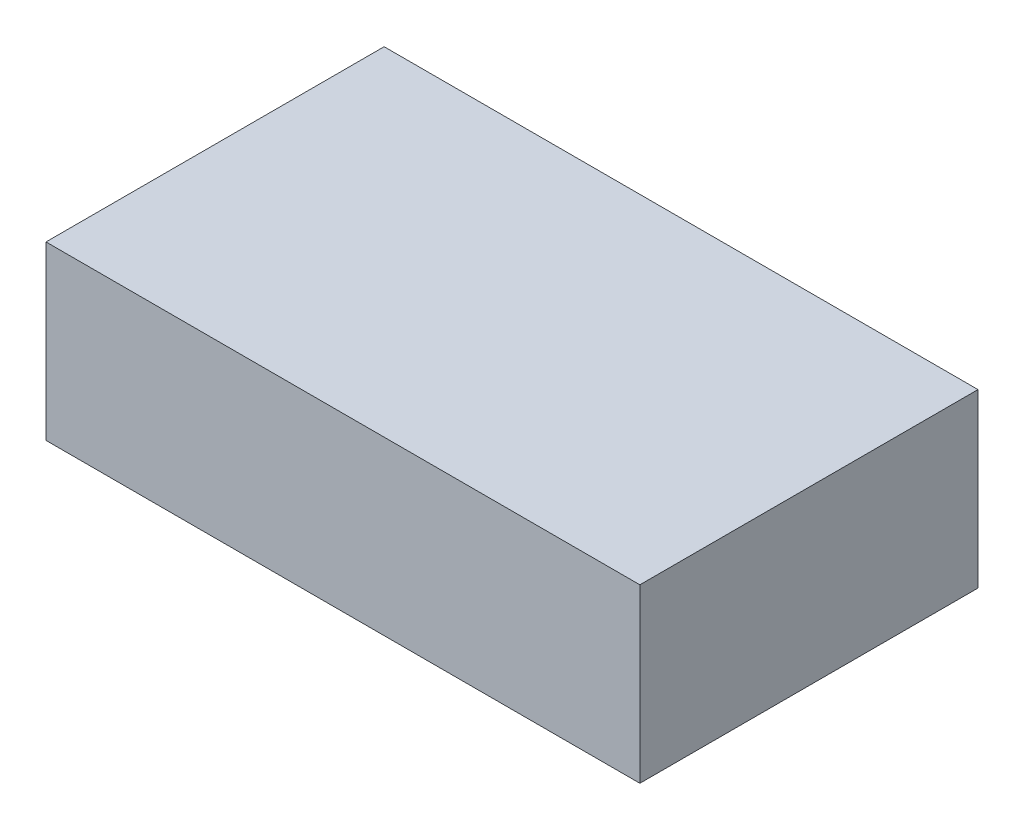
ISO-10303-21;
HEADER;
FILE_DESCRIPTION(('STEP AP214'),'2;1');
FILE_NAME('part.step','',(''),(''),'','','');
FILE_SCHEMA(('AUTOMOTIVE_DESIGN { 1 0 10303 214 1 1 1 1 }'));
ENDSEC;
DATA;
#1=APPLICATION_CONTEXT('core data for automotive mechanical design processes');
#2=APPLICATION_PROTOCOL_DEFINITION('international standard','automotive_design',2000,#1);
#3=PRODUCT_CONTEXT('',#1,'mechanical');
#4=PRODUCT('Part','Part','',(#3));
#5=PRODUCT_RELATED_PRODUCT_CATEGORY('part','',(#4));
#6=PRODUCT_DEFINITION_FORMATION('','',#4);
#7=PRODUCT_DEFINITION_CONTEXT('part definition',#1,'design');
#8=PRODUCT_DEFINITION('design','',#6,#7);
#9=PRODUCT_DEFINITION_SHAPE('','',#8);
#10=(LENGTH_UNIT() NAMED_UNIT(*) SI_UNIT(.MILLI.,.METRE.));
#11=(NAMED_UNIT(*) PLANE_ANGLE_UNIT() SI_UNIT($,.RADIAN.));
#12=(NAMED_UNIT(*) SI_UNIT($,.STERADIAN.) SOLID_ANGLE_UNIT());
#13=UNCERTAINTY_MEASURE_WITH_UNIT(LENGTH_MEASURE(1.E-05),#10,'distance_accuracy_value','');
#14=(GEOMETRIC_REPRESENTATION_CONTEXT(3) GLOBAL_UNCERTAINTY_ASSIGNED_CONTEXT((#13)) GLOBAL_UNIT_ASSIGNED_CONTEXT((#10,
#11,#12)) REPRESENTATION_CONTEXT('',''));
#15=CARTESIAN_POINT('',(0.,0.,0.));
#16=DIRECTION('',(0.,0.,1.));
#17=DIRECTION('',(1.,0.,0.));
#18=AXIS2_PLACEMENT_3D('',#15,#16,#17);
#19=CARTESIAN_POINT('',(52.25,30.25,-29.75));
#20=DIRECTION('',(-1.,0.,0.));
#21=DIRECTION('',(0.,0.,1.));
#22=AXIS2_PLACEMENT_3D('',#19,#20,#21);
#23=PLANE('',#22);
#24=DIRECTION('',(0.,0.,-1.));
#25=VECTOR('',#24,1.);
#26=CARTESIAN_POINT('',(52.25,0.,-29.75));
#27=LINE('',#26,#25);
#28=CARTESIAN_POINT('',(52.25,0.,29.75));
#29=VERTEX_POINT('',#28);
#30=CARTESIAN_POINT('',(52.25,0.,-29.75));
#31=VERTEX_POINT('',#30);
#32=EDGE_CURVE('E147',#29,#31,#27,.T.);
#33=ORIENTED_EDGE('',*,*,#32,.T.);
#34=DIRECTION('',(0.,-1.,0.));
#35=VECTOR('',#34,1.);
#36=CARTESIAN_POINT('',(52.25,30.25,-29.75));
#37=LINE('',#36,#35);
#38=CARTESIAN_POINT('',(52.25,30.25,-29.75));
#39=VERTEX_POINT('',#38);
#40=EDGE_CURVE('E47',#39,#31,#37,.T.);
#41=ORIENTED_EDGE('',*,*,#40,.F.);
#42=DIRECTION('',(0.,0.,-1.));
#43=VECTOR('',#42,1.);
#44=CARTESIAN_POINT('',(52.25,30.25,-29.75));
#45=LINE('',#44,#43);
#46=CARTESIAN_POINT('',(52.25,30.25,29.75));
#47=VERTEX_POINT('',#46);
#48=EDGE_CURVE('E148',#47,#39,#45,.T.);
#49=ORIENTED_EDGE('',*,*,#48,.F.);
#50=DIRECTION('',(0.,-1.,0.));
#51=VECTOR('',#50,1.);
#52=CARTESIAN_POINT('',(52.25,30.25,29.75));
#53=LINE('',#52,#51);
#54=EDGE_CURVE('E154',#47,#29,#53,.T.);
#55=ORIENTED_EDGE('',*,*,#54,.T.);
#56=EDGE_LOOP('',(#33,#41,#49,#55));
#57=FACE_BOUND('',#56,.T.);
#58=ADVANCED_FACE('F39',(#57),#23,.F.);
#59=CARTESIAN_POINT('',(-52.25,30.25,-29.75));
#60=DIRECTION('',(0.,0.,1.));
#61=DIRECTION('',(1.,0.,0.));
#62=AXIS2_PLACEMENT_3D('',#59,#60,#61);
#63=PLANE('',#62);
#64=DIRECTION('',(-1.,0.,0.));
#65=VECTOR('',#64,1.);
#66=CARTESIAN_POINT('',(-52.25,0.,-29.75));
#67=LINE('',#66,#65);
#68=CARTESIAN_POINT('',(-52.25,0.,-29.75));
#69=VERTEX_POINT('',#68);
#70=EDGE_CURVE('E157',#31,#69,#67,.T.);
#71=ORIENTED_EDGE('',*,*,#70,.T.);
#72=DIRECTION('',(0.,-1.,0.));
#73=VECTOR('',#72,1.);
#74=CARTESIAN_POINT('',(-52.25,30.25,-29.75));
#75=LINE('',#74,#73);
#76=CARTESIAN_POINT('',(-52.25,30.25,-29.75));
#77=VERTEX_POINT('',#76);
#78=EDGE_CURVE('E164',#77,#69,#75,.T.);
#79=ORIENTED_EDGE('',*,*,#78,.F.);
#80=DIRECTION('',(-1.,0.,0.));
#81=VECTOR('',#80,1.);
#82=CARTESIAN_POINT('',(-52.25,30.25,-29.75));
#83=LINE('',#82,#81);
#84=EDGE_CURVE('E87',#39,#77,#83,.T.);
#85=ORIENTED_EDGE('',*,*,#84,.F.);
#86=ORIENTED_EDGE('',*,*,#40,.T.);
#87=EDGE_LOOP('',(#71,#79,#85,#86));
#88=FACE_BOUND('',#87,.T.);
#89=ADVANCED_FACE('F166',(#88),#63,.F.);
#90=CARTESIAN_POINT('',(-52.25,30.25,-29.75));
#91=DIRECTION('',(1.,0.,0.));
#92=DIRECTION('',(0.,0.,-1.));
#93=AXIS2_PLACEMENT_3D('',#90,#91,#92);
#94=PLANE('',#93);
#95=CARTESIAN_POINT('',(-52.25,11.6,0.));
#96=DIRECTION('',(1.,0.,0.));
#97=DIRECTION('',(0.,0.,-1.));
#98=AXIS2_PLACEMENT_3D('',#95,#96,#97);
#99=CIRCLE('',#98,2.);
#100=CARTESIAN_POINT('',(-52.25,11.6,-2.));
#101=VERTEX_POINT('',#100);
#102=EDGE_CURVE('E11',#101,#101,#99,.F.);
#103=ORIENTED_EDGE('',*,*,#102,.F.);
#104=EDGE_LOOP('',(#103));
#105=FACE_BOUND('',#104,.T.);
#106=DIRECTION('',(0.,0.,1.));
#107=VECTOR('',#106,1.);
#108=CARTESIAN_POINT('',(-52.25,0.,-29.75));
#109=LINE('',#108,#107);
#110=CARTESIAN_POINT('',(-52.25,0.,29.75));
#111=VERTEX_POINT('',#110);
#112=EDGE_CURVE('E73',#69,#111,#109,.T.);
#113=ORIENTED_EDGE('',*,*,#112,.T.);
#114=DIRECTION('',(0.,-1.,0.));
#115=VECTOR('',#114,1.);
#116=CARTESIAN_POINT('',(-52.25,30.25,29.75));
#117=LINE('',#116,#115);
#118=CARTESIAN_POINT('',(-52.25,30.25,29.75));
#119=VERTEX_POINT('',#118);
#120=EDGE_CURVE('E162',#119,#111,#117,.T.);
#121=ORIENTED_EDGE('',*,*,#120,.F.);
#122=DIRECTION('',(0.,0.,1.));
#123=VECTOR('',#122,1.);
#124=CARTESIAN_POINT('',(-52.25,30.25,-29.75));
#125=LINE('',#124,#123);
#126=EDGE_CURVE('E151',#77,#119,#125,.T.);
#127=ORIENTED_EDGE('',*,*,#126,.F.);
#128=ORIENTED_EDGE('',*,*,#78,.T.);
#129=EDGE_LOOP('',(#113,#121,#127,#128));
#130=FACE_BOUND('',#129,.T.);
#131=ADVANCED_FACE('F195',(#105,#130),#94,.F.);
#132=CARTESIAN_POINT('',(-52.25,30.25,29.75));
#133=DIRECTION('',(0.,0.,-1.));
#134=DIRECTION('',(-1.,0.,0.));
#135=AXIS2_PLACEMENT_3D('',#132,#133,#134);
#136=PLANE('',#135);
#137=DIRECTION('',(1.,0.,0.));
#138=VECTOR('',#137,1.);
#139=CARTESIAN_POINT('',(-52.25,0.,29.75));
#140=LINE('',#139,#138);
#141=EDGE_CURVE('E79',#111,#29,#140,.T.);
#142=ORIENTED_EDGE('',*,*,#141,.T.);
#143=ORIENTED_EDGE('',*,*,#54,.F.);
#144=DIRECTION('',(1.,0.,0.));
#145=VECTOR('',#144,1.);
#146=CARTESIAN_POINT('',(-52.25,30.25,29.75));
#147=LINE('',#146,#145);
#148=EDGE_CURVE('E55',#119,#47,#147,.T.);
#149=ORIENTED_EDGE('',*,*,#148,.F.);
#150=ORIENTED_EDGE('',*,*,#120,.T.);
#151=EDGE_LOOP('',(#142,#143,#149,#150));
#152=FACE_BOUND('',#151,.T.);
#153=ADVANCED_FACE('F186',(#152),#136,.F.);
#154=CARTESIAN_POINT('',(0.,30.25,0.));
#155=DIRECTION('',(0.,1.,0.));
#156=DIRECTION('',(0.,0.,1.));
#157=AXIS2_PLACEMENT_3D('',#154,#155,#156);
#158=PLANE('',#157);
#159=ORIENTED_EDGE('',*,*,#48,.T.);
#160=ORIENTED_EDGE('',*,*,#84,.T.);
#161=ORIENTED_EDGE('',*,*,#126,.T.);
#162=ORIENTED_EDGE('',*,*,#148,.T.);
#163=EDGE_LOOP('',(#159,#160,#161,#162));
#164=FACE_BOUND('',#163,.T.);
#165=ADVANCED_FACE('F174',(#164),#158,.T.);
#166=CARTESIAN_POINT('',(0.,0.,0.));
#167=DIRECTION('',(0.,1.,0.));
#168=DIRECTION('',(0.,0.,1.));
#169=AXIS2_PLACEMENT_3D('',#166,#167,#168);
#170=PLANE('',#169);
#171=CARTESIAN_POINT('',(36.5,0.,-20.5));
#172=DIRECTION('',(0.,-1.,0.));
#173=DIRECTION('',(0.,0.,-1.));
#174=AXIS2_PLACEMENT_3D('',#171,#172,#173);
#175=CIRCLE('',#174,2.275);
#176=CARTESIAN_POINT('',(36.5,0.,-22.775));
#177=VERTEX_POINT('',#176);
#178=EDGE_CURVE('E117',#177,#177,#175,.T.);
#179=ORIENTED_EDGE('',*,*,#178,.F.);
#180=EDGE_LOOP('',(#179));
#181=FACE_BOUND('',#180,.T.);
#182=CARTESIAN_POINT('',(36.5,0.,20.5));
#183=DIRECTION('',(0.,-1.,0.));
#184=DIRECTION('',(0.,0.,-1.));
#185=AXIS2_PLACEMENT_3D('',#182,#183,#184);
#186=CIRCLE('',#185,2.275);
#187=CARTESIAN_POINT('',(36.5,0.,18.225));
#188=VERTEX_POINT('',#187);
#189=EDGE_CURVE('E110',#188,#188,#186,.T.);
#190=ORIENTED_EDGE('',*,*,#189,.F.);
#191=EDGE_LOOP('',(#190));
#192=FACE_BOUND('',#191,.T.);
#193=CARTESIAN_POINT('',(-36.5,0.,20.5));
#194=DIRECTION('',(0.,-1.,0.));
#195=DIRECTION('',(0.,0.,-1.));
#196=AXIS2_PLACEMENT_3D('',#193,#194,#195);
#197=CIRCLE('',#196,2.275);
#198=CARTESIAN_POINT('',(-36.5,0.,18.225));
#199=VERTEX_POINT('',#198);
#200=EDGE_CURVE('E126',#199,#199,#197,.T.);
#201=ORIENTED_EDGE('',*,*,#200,.F.);
#202=EDGE_LOOP('',(#201));
#203=FACE_BOUND('',#202,.T.);
#204=CARTESIAN_POINT('',(-36.5,0.,-20.5));
#205=DIRECTION('',(0.,-1.,0.));
#206=DIRECTION('',(0.,0.,-1.));
#207=AXIS2_PLACEMENT_3D('',#204,#205,#206);
#208=CIRCLE('',#207,2.275);
#209=CARTESIAN_POINT('',(-36.5,0.,-22.775));
#210=VERTEX_POINT('',#209);
#211=EDGE_CURVE('E135',#210,#210,#208,.T.);
#212=ORIENTED_EDGE('',*,*,#211,.F.);
#213=EDGE_LOOP('',(#212));
#214=FACE_BOUND('',#213,.T.);
#215=ORIENTED_EDGE('',*,*,#32,.F.);
#216=ORIENTED_EDGE('',*,*,#141,.F.);
#217=ORIENTED_EDGE('',*,*,#112,.F.);
#218=ORIENTED_EDGE('',*,*,#70,.F.);
#219=EDGE_LOOP('',(#215,#216,#217,#218));
#220=FACE_BOUND('',#219,.T.);
#221=ADVANCED_FACE('F171',(#181,#192,#203,#214,#220),#170,.F.);
#222=CARTESIAN_POINT('',(-62.25,11.6,0.));
#223=DIRECTION('',(1.,0.,0.));
#224=DIRECTION('',(0.,0.,-1.));
#225=AXIS2_PLACEMENT_3D('',#222,#223,#224);
#226=CYLINDRICAL_SURFACE('',#225,2.);
#227=CARTESIAN_POINT('',(-62.25,11.6,0.));
#228=DIRECTION('',(-1.,0.,0.));
#229=DIRECTION('',(0.,0.,1.));
#230=AXIS2_PLACEMENT_3D('',#227,#228,#229);
#231=CIRCLE('',#230,2.);
#232=CARTESIAN_POINT('',(-62.25,11.6,2.));
#233=VERTEX_POINT('',#232);
#234=EDGE_CURVE('E144',#233,#233,#231,.T.);
#235=ORIENTED_EDGE('',*,*,#234,.F.);
#236=EDGE_LOOP('',(#235));
#237=FACE_BOUND('',#236,.T.);
#238=ORIENTED_EDGE('',*,*,#102,.T.);
#239=EDGE_LOOP('',(#238));
#240=FACE_BOUND('',#239,.T.);
#241=ADVANCED_FACE('F173',(#237,#240),#226,.T.);
#242=CARTESIAN_POINT('',(-62.25,11.6,0.));
#243=DIRECTION('',(-1.,0.,0.));
#244=DIRECTION('',(0.,0.,1.));
#245=AXIS2_PLACEMENT_3D('',#242,#243,#244);
#246=PLANE('',#245);
#247=ORIENTED_EDGE('',*,*,#234,.T.);
#248=EDGE_LOOP('',(#247));
#249=FACE_BOUND('',#248,.T.);
#250=ADVANCED_FACE('F182',(#249),#246,.T.);
#251=CARTESIAN_POINT('',(-36.5,10.,-20.5));
#252=DIRECTION('',(0.,-1.,0.));
#253=DIRECTION('',(0.,0.,-1.));
#254=AXIS2_PLACEMENT_3D('',#251,#252,#253);
#255=CONICAL_SURFACE('',#254,2.25,1.02974425867665);
#256=CARTESIAN_POINT('',(-36.5,11.351936392812,-20.5));
#257=VERTEX_POINT('',#256);
#258=VERTEX_LOOP('',#257);
#259=FACE_BOUND('',#258,.T.);
#260=CARTESIAN_POINT('',(-36.5,10.,-20.5));
#261=DIRECTION('',(0.,-1.,0.));
#262=DIRECTION('',(0.,0.,-1.));
#263=AXIS2_PLACEMENT_3D('',#260,#261,#262);
#264=CIRCLE('',#263,2.25);
#265=CARTESIAN_POINT('',(-36.5,10.,-22.75));
#266=VERTEX_POINT('',#265);
#267=EDGE_CURVE('E141',#266,#266,#264,.T.);
#268=ORIENTED_EDGE('',*,*,#267,.T.);
#269=EDGE_LOOP('',(#268));
#270=FACE_BOUND('',#269,.T.);
#271=ADVANCED_FACE('F224',(#259,#270),#255,.F.);
#272=CARTESIAN_POINT('',(-36.5,0.,-20.5));
#273=DIRECTION('',(0.,-1.,0.));
#274=DIRECTION('',(0.,0.,-1.));
#275=AXIS2_PLACEMENT_3D('',#272,#273,#274);
#276=CYLINDRICAL_SURFACE('',#275,2.25);
#277=ORIENTED_EDGE('',*,*,#267,.F.);
#278=EDGE_LOOP('',(#277));
#279=FACE_BOUND('',#278,.T.);
#280=CARTESIAN_POINT('',(-36.5,0.0250000000000007,-20.5));
#281=DIRECTION('',(0.,-1.,0.));
#282=DIRECTION('',(0.,0.,-1.));
#283=AXIS2_PLACEMENT_3D('',#280,#281,#282);
#284=CIRCLE('',#283,2.25);
#285=CARTESIAN_POINT('',(-36.5,0.0250000000000007,-22.75));
#286=VERTEX_POINT('',#285);
#287=EDGE_CURVE('E138',#286,#286,#284,.T.);
#288=ORIENTED_EDGE('',*,*,#287,.T.);
#289=EDGE_LOOP('',(#288));
#290=FACE_BOUND('',#289,.T.);
#291=ADVANCED_FACE('F236',(#279,#290),#276,.F.);
#292=CARTESIAN_POINT('',(-36.5,0.,-20.5));
#293=DIRECTION('',(0.,-1.,0.));
#294=DIRECTION('',(0.,0.,-1.));
#295=AXIS2_PLACEMENT_3D('',#292,#293,#294);
#296=CONICAL_SURFACE('',#295,2.275,0.785398163397483);
#297=ORIENTED_EDGE('',*,*,#287,.F.);
#298=EDGE_LOOP('',(#297));
#299=FACE_BOUND('',#298,.T.);
#300=ORIENTED_EDGE('',*,*,#211,.T.);
#301=EDGE_LOOP('',(#300));
#302=FACE_BOUND('',#301,.T.);
#303=ADVANCED_FACE('F246',(#299,#302),#296,.F.);
#304=CARTESIAN_POINT('',(-36.5,10.,20.5));
#305=DIRECTION('',(0.,-1.,0.));
#306=DIRECTION('',(0.,0.,-1.));
#307=AXIS2_PLACEMENT_3D('',#304,#305,#306);
#308=CONICAL_SURFACE('',#307,2.25,1.02974425867665);
#309=CARTESIAN_POINT('',(-36.5,11.351936392812,20.5));
#310=VERTEX_POINT('',#309);
#311=VERTEX_LOOP('',#310);
#312=FACE_BOUND('',#311,.T.);
#313=CARTESIAN_POINT('',(-36.5,10.,20.5));
#314=DIRECTION('',(0.,-1.,0.));
#315=DIRECTION('',(0.,0.,-1.));
#316=AXIS2_PLACEMENT_3D('',#313,#314,#315);
#317=CIRCLE('',#316,2.25);
#318=CARTESIAN_POINT('',(-36.5,10.,18.25));
#319=VERTEX_POINT('',#318);
#320=EDGE_CURVE('E132',#319,#319,#317,.T.);
#321=ORIENTED_EDGE('',*,*,#320,.T.);
#322=EDGE_LOOP('',(#321));
#323=FACE_BOUND('',#322,.T.);
#324=ADVANCED_FACE('F256',(#312,#323),#308,.F.);
#325=CARTESIAN_POINT('',(-36.5,0.,20.5));
#326=DIRECTION('',(0.,-1.,0.));
#327=DIRECTION('',(0.,0.,-1.));
#328=AXIS2_PLACEMENT_3D('',#325,#326,#327);
#329=CYLINDRICAL_SURFACE('',#328,2.25);
#330=ORIENTED_EDGE('',*,*,#320,.F.);
#331=EDGE_LOOP('',(#330));
#332=FACE_BOUND('',#331,.T.);
#333=CARTESIAN_POINT('',(-36.5,0.0250000000000007,20.5));
#334=DIRECTION('',(0.,-1.,0.));
#335=DIRECTION('',(0.,0.,-1.));
#336=AXIS2_PLACEMENT_3D('',#333,#334,#335);
#337=CIRCLE('',#336,2.25);
#338=CARTESIAN_POINT('',(-36.5,0.0250000000000007,18.25));
#339=VERTEX_POINT('',#338);
#340=EDGE_CURVE('E129',#339,#339,#337,.T.);
#341=ORIENTED_EDGE('',*,*,#340,.T.);
#342=EDGE_LOOP('',(#341));
#343=FACE_BOUND('',#342,.T.);
#344=ADVANCED_FACE('F266',(#332,#343),#329,.F.);
#345=CARTESIAN_POINT('',(-36.5,0.,20.5));
#346=DIRECTION('',(0.,-1.,0.));
#347=DIRECTION('',(0.,0.,-1.));
#348=AXIS2_PLACEMENT_3D('',#345,#346,#347);
#349=CONICAL_SURFACE('',#348,2.275,0.785398163397483);
#350=ORIENTED_EDGE('',*,*,#340,.F.);
#351=EDGE_LOOP('',(#350));
#352=FACE_BOUND('',#351,.T.);
#353=ORIENTED_EDGE('',*,*,#200,.T.);
#354=EDGE_LOOP('',(#353));
#355=FACE_BOUND('',#354,.T.);
#356=ADVANCED_FACE('F276',(#352,#355),#349,.F.);
#357=CARTESIAN_POINT('',(36.5,10.,20.5));
#358=DIRECTION('',(0.,-1.,0.));
#359=DIRECTION('',(0.,0.,-1.));
#360=AXIS2_PLACEMENT_3D('',#357,#358,#359);
#361=CONICAL_SURFACE('',#360,2.25,1.02974425867665);
#362=CARTESIAN_POINT('',(36.5,11.351936392812,20.5));
#363=VERTEX_POINT('',#362);
#364=VERTEX_LOOP('',#363);
#365=FACE_BOUND('',#364,.T.);
#366=CARTESIAN_POINT('',(36.5,10.,20.5));
#367=DIRECTION('',(0.,-1.,0.));
#368=DIRECTION('',(0.,0.,-1.));
#369=AXIS2_PLACEMENT_3D('',#366,#367,#368);
#370=CIRCLE('',#369,2.25);
#371=CARTESIAN_POINT('',(36.5,10.,18.25));
#372=VERTEX_POINT('',#371);
#373=EDGE_CURVE('E123',#372,#372,#370,.T.);
#374=ORIENTED_EDGE('',*,*,#373,.T.);
#375=EDGE_LOOP('',(#374));
#376=FACE_BOUND('',#375,.T.);
#377=ADVANCED_FACE('F286',(#365,#376),#361,.F.);
#378=CARTESIAN_POINT('',(36.5,0.,20.5));
#379=DIRECTION('',(0.,-1.,0.));
#380=DIRECTION('',(0.,0.,-1.));
#381=AXIS2_PLACEMENT_3D('',#378,#379,#380);
#382=CYLINDRICAL_SURFACE('',#381,2.25);
#383=ORIENTED_EDGE('',*,*,#373,.F.);
#384=EDGE_LOOP('',(#383));
#385=FACE_BOUND('',#384,.T.);
#386=CARTESIAN_POINT('',(36.5,0.0250000000000007,20.5));
#387=DIRECTION('',(0.,-1.,0.));
#388=DIRECTION('',(0.,0.,-1.));
#389=AXIS2_PLACEMENT_3D('',#386,#387,#388);
#390=CIRCLE('',#389,2.25);
#391=CARTESIAN_POINT('',(36.5,0.0250000000000007,18.25));
#392=VERTEX_POINT('',#391);
#393=EDGE_CURVE('E114',#392,#392,#390,.T.);
#394=ORIENTED_EDGE('',*,*,#393,.T.);
#395=EDGE_LOOP('',(#394));
#396=FACE_BOUND('',#395,.T.);
#397=ADVANCED_FACE('F296',(#385,#396),#382,.F.);
#398=CARTESIAN_POINT('',(36.5,0.,20.5));
#399=DIRECTION('',(0.,-1.,0.));
#400=DIRECTION('',(0.,0.,-1.));
#401=AXIS2_PLACEMENT_3D('',#398,#399,#400);
#402=CONICAL_SURFACE('',#401,2.275,0.785398163397483);
#403=ORIENTED_EDGE('',*,*,#393,.F.);
#404=EDGE_LOOP('',(#403));
#405=FACE_BOUND('',#404,.T.);
#406=ORIENTED_EDGE('',*,*,#189,.T.);
#407=EDGE_LOOP('',(#406));
#408=FACE_BOUND('',#407,.T.);
#409=ADVANCED_FACE('F104',(#405,#408),#402,.F.);
#410=CARTESIAN_POINT('',(36.5,10.,-20.5));
#411=DIRECTION('',(0.,-1.,0.));
#412=DIRECTION('',(0.,0.,-1.));
#413=AXIS2_PLACEMENT_3D('',#410,#411,#412);
#414=CONICAL_SURFACE('',#413,2.25,1.02974425867665);
#415=CARTESIAN_POINT('',(36.5,11.351936392812,-20.5));
#416=VERTEX_POINT('',#415);
#417=VERTEX_LOOP('',#416);
#418=FACE_BOUND('',#417,.T.);
#419=CARTESIAN_POINT('',(36.5,10.,-20.5));
#420=DIRECTION('',(0.,-1.,0.));
#421=DIRECTION('',(0.,0.,-1.));
#422=AXIS2_PLACEMENT_3D('',#419,#420,#421);
#423=CIRCLE('',#422,2.25);
#424=CARTESIAN_POINT('',(36.5,10.,-22.75));
#425=VERTEX_POINT('',#424);
#426=EDGE_CURVE('E108',#425,#425,#423,.T.);
#427=ORIENTED_EDGE('',*,*,#426,.T.);
#428=EDGE_LOOP('',(#427));
#429=FACE_BOUND('',#428,.T.);
#430=ADVANCED_FACE('F100',(#418,#429),#414,.F.);
#431=CARTESIAN_POINT('',(36.5,0.,-20.5));
#432=DIRECTION('',(0.,-1.,0.));
#433=DIRECTION('',(0.,0.,-1.));
#434=AXIS2_PLACEMENT_3D('',#431,#432,#433);
#435=CYLINDRICAL_SURFACE('',#434,2.25);
#436=ORIENTED_EDGE('',*,*,#426,.F.);
#437=EDGE_LOOP('',(#436));
#438=FACE_BOUND('',#437,.T.);
#439=CARTESIAN_POINT('',(36.5,0.0250000000000007,-20.5));
#440=DIRECTION('',(0.,-1.,0.));
#441=DIRECTION('',(0.,0.,-1.));
#442=AXIS2_PLACEMENT_3D('',#439,#440,#441);
#443=CIRCLE('',#442,2.25);
#444=CARTESIAN_POINT('',(36.5,0.0250000000000007,-22.75));
#445=VERTEX_POINT('',#444);
#446=EDGE_CURVE('E111',#445,#445,#443,.T.);
#447=ORIENTED_EDGE('',*,*,#446,.T.);
#448=EDGE_LOOP('',(#447));
#449=FACE_BOUND('',#448,.T.);
#450=ADVANCED_FACE('F103',(#438,#449),#435,.F.);
#451=CARTESIAN_POINT('',(36.5,0.,-20.5));
#452=DIRECTION('',(0.,-1.,0.));
#453=DIRECTION('',(0.,0.,-1.));
#454=AXIS2_PLACEMENT_3D('',#451,#452,#453);
#455=CONICAL_SURFACE('',#454,2.275,0.785398163397483);
#456=ORIENTED_EDGE('',*,*,#446,.F.);
#457=EDGE_LOOP('',(#456));
#458=FACE_BOUND('',#457,.T.);
#459=ORIENTED_EDGE('',*,*,#178,.T.);
#460=EDGE_LOOP('',(#459));
#461=FACE_BOUND('',#460,.T.);
#462=ADVANCED_FACE('F330',(#458,#461),#455,.F.);
#463=CLOSED_SHELL('',(#58,#89,#131,#153,#165,#221,#241,#250,#271,#291,#303,#324,#344,#356,#377,
#397,#409,#430,#450,#462));
#464=MANIFOLD_SOLID_BREP('B2',#463);
#465=ADVANCED_BREP_SHAPE_REPRESENTATION('',(#18,#464),#14);
#466=SHAPE_DEFINITION_REPRESENTATION(#9,#465);
ENDSEC;
END-ISO-10303-21;
